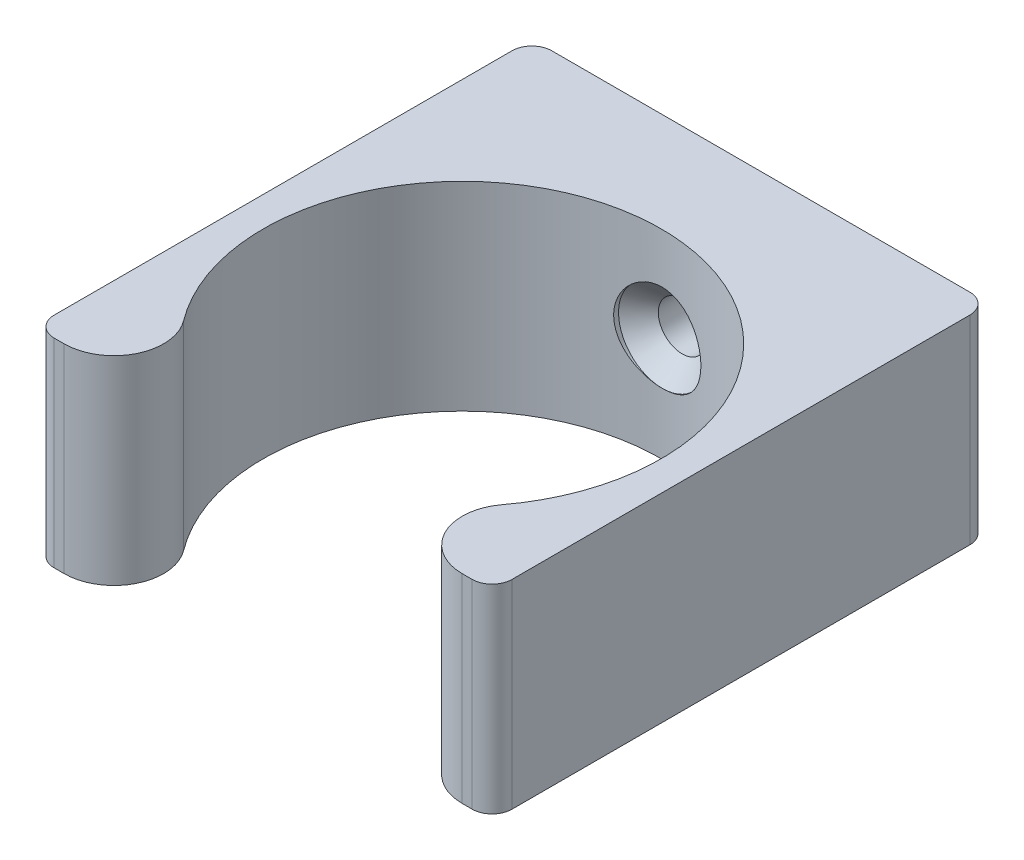
ISO-10303-21;
HEADER;
FILE_DESCRIPTION(('STEP AP214'),'2;1');
FILE_NAME('part.step','',(''),(''),'','','');
FILE_SCHEMA(('AUTOMOTIVE_DESIGN { 1 0 10303 214 1 1 1 1 }'));
ENDSEC;
DATA;
#1=APPLICATION_CONTEXT('core data for automotive mechanical design processes');
#2=APPLICATION_PROTOCOL_DEFINITION('international standard','automotive_design',2000,#1);
#3=PRODUCT_CONTEXT('',#1,'mechanical');
#4=PRODUCT('Part','Part','',(#3));
#5=PRODUCT_RELATED_PRODUCT_CATEGORY('part','',(#4));
#6=PRODUCT_DEFINITION_FORMATION('','',#4);
#7=PRODUCT_DEFINITION_CONTEXT('part definition',#1,'design');
#8=PRODUCT_DEFINITION('design','',#6,#7);
#9=PRODUCT_DEFINITION_SHAPE('','',#8);
#10=(LENGTH_UNIT() NAMED_UNIT(*) SI_UNIT(.MILLI.,.METRE.));
#11=(NAMED_UNIT(*) PLANE_ANGLE_UNIT() SI_UNIT($,.RADIAN.));
#12=(NAMED_UNIT(*) SI_UNIT($,.STERADIAN.) SOLID_ANGLE_UNIT());
#13=UNCERTAINTY_MEASURE_WITH_UNIT(LENGTH_MEASURE(1.E-05),#10,'distance_accuracy_value','');
#14=(GEOMETRIC_REPRESENTATION_CONTEXT(3) GLOBAL_UNCERTAINTY_ASSIGNED_CONTEXT((#13)) GLOBAL_UNIT_ASSIGNED_CONTEXT((#10,
#11,#12)) REPRESENTATION_CONTEXT('',''));
#15=CARTESIAN_POINT('',(0.,0.,0.));
#16=DIRECTION('',(0.,0.,1.));
#17=DIRECTION('',(1.,0.,0.));
#18=AXIS2_PLACEMENT_3D('',#15,#16,#17);
#19=CARTESIAN_POINT('',(10.,10.,9.99974885724246));
#20=DIRECTION('',(0.,-1.,0.));
#21=DIRECTION('',(0.,0.,-1.));
#22=AXIS2_PLACEMENT_3D('',#19,#20,#21);
#23=CYLINDRICAL_SURFACE('',#22,2.50025114275754);
#24=CARTESIAN_POINT('',(10.,0.,9.99974885724246));
#25=DIRECTION('',(0.,1.,0.));
#26=DIRECTION('',(0.,0.,-1.));
#27=AXIS2_PLACEMENT_3D('',#24,#25,#26);
#28=CIRCLE('',#27,2.50025114275754);
#29=CARTESIAN_POINT('',(7.97597757954962,0.,8.53189701922387));
#30=VERTEX_POINT('',#29);
#31=CARTESIAN_POINT('',(10.,0.,12.5));
#32=VERTEX_POINT('',#31);
#33=EDGE_CURVE('E163',#30,#32,#28,.T.);
#34=ORIENTED_EDGE('',*,*,#33,.T.);
#35=DIRECTION('',(0.,-1.,0.));
#36=VECTOR('',#35,1.);
#37=CARTESIAN_POINT('',(10.,10.,12.5));
#38=LINE('',#37,#36);
#39=CARTESIAN_POINT('',(10.,10.,12.5));
#40=VERTEX_POINT('',#39);
#41=EDGE_CURVE('E11',#40,#32,#38,.T.);
#42=ORIENTED_EDGE('',*,*,#41,.F.);
#43=CARTESIAN_POINT('',(10.,10.,9.99974885724246));
#44=DIRECTION('',(0.,1.,0.));
#45=DIRECTION('',(0.,0.,-1.));
#46=AXIS2_PLACEMENT_3D('',#43,#44,#45);
#47=CIRCLE('',#46,2.50025114275754);
#48=CARTESIAN_POINT('',(7.97597757954962,10.,8.53189701922387));
#49=VERTEX_POINT('',#48);
#50=EDGE_CURVE('E187',#49,#40,#47,.T.);
#51=ORIENTED_EDGE('',*,*,#50,.F.);
#52=DIRECTION('',(0.,-1.,0.));
#53=VECTOR('',#52,1.);
#54=CARTESIAN_POINT('',(7.97597757954962,10.,8.53189701922387));
#55=LINE('',#54,#53);
#56=EDGE_CURVE('E159',#49,#30,#55,.T.);
#57=ORIENTED_EDGE('',*,*,#56,.T.);
#58=EDGE_LOOP('',(#34,#42,#51,#57));
#59=FACE_BOUND('',#58,.T.);
#60=ADVANCED_FACE('F33',(#59),#23,.T.);
#61=CARTESIAN_POINT('',(10.,10.,12.5));
#62=DIRECTION('',(0.,0.,-1.));
#63=DIRECTION('',(-1.,0.,0.));
#64=AXIS2_PLACEMENT_3D('',#61,#62,#63);
#65=PLANE('',#64);
#66=DIRECTION('',(1.,0.,0.));
#67=VECTOR('',#66,1.);
#68=CARTESIAN_POINT('',(10.,0.,12.5));
#69=LINE('',#68,#67);
#70=CARTESIAN_POINT('',(10.5,0.,12.5));
#71=VERTEX_POINT('',#70);
#72=EDGE_CURVE('E166',#32,#71,#69,.T.);
#73=ORIENTED_EDGE('',*,*,#72,.T.);
#74=DIRECTION('',(0.,-1.,0.));
#75=VECTOR('',#74,1.);
#76=CARTESIAN_POINT('',(10.5,10.,12.5));
#77=LINE('',#76,#75);
#78=CARTESIAN_POINT('',(10.5,10.,12.5));
#79=VERTEX_POINT('',#78);
#80=EDGE_CURVE('E41',#79,#71,#77,.T.);
#81=ORIENTED_EDGE('',*,*,#80,.F.);
#82=DIRECTION('',(1.,0.,0.));
#83=VECTOR('',#82,1.);
#84=CARTESIAN_POINT('',(10.,10.,12.5));
#85=LINE('',#84,#83);
#86=EDGE_CURVE('E109',#40,#79,#85,.T.);
#87=ORIENTED_EDGE('',*,*,#86,.F.);
#88=ORIENTED_EDGE('',*,*,#41,.T.);
#89=EDGE_LOOP('',(#73,#81,#87,#88));
#90=FACE_BOUND('',#89,.T.);
#91=ADVANCED_FACE('F287',(#90),#65,.F.);
#92=CARTESIAN_POINT('',(10.5,10.,11.5));
#93=DIRECTION('',(0.,-1.,0.));
#94=DIRECTION('',(0.,0.,-1.));
#95=AXIS2_PLACEMENT_3D('',#92,#93,#94);
#96=CYLINDRICAL_SURFACE('',#95,0.999999999999999);
#97=CARTESIAN_POINT('',(10.5,0.,11.5));
#98=DIRECTION('',(0.,1.,0.));
#99=DIRECTION('',(0.,0.,-1.));
#100=AXIS2_PLACEMENT_3D('',#97,#98,#99);
#101=CIRCLE('',#100,0.999999999999999);
#102=CARTESIAN_POINT('',(11.5,0.,11.5));
#103=VERTEX_POINT('',#102);
#104=EDGE_CURVE('E169',#71,#103,#101,.T.);
#105=ORIENTED_EDGE('',*,*,#104,.T.);
#106=DIRECTION('',(0.,-1.,0.));
#107=VECTOR('',#106,1.);
#108=CARTESIAN_POINT('',(11.5,10.,11.5));
#109=LINE('',#108,#107);
#110=CARTESIAN_POINT('',(11.5,10.,11.5));
#111=VERTEX_POINT('',#110);
#112=EDGE_CURVE('E206',#111,#103,#109,.T.);
#113=ORIENTED_EDGE('',*,*,#112,.F.);
#114=CARTESIAN_POINT('',(10.5,10.,11.5));
#115=DIRECTION('',(0.,1.,0.));
#116=DIRECTION('',(0.,0.,-1.));
#117=AXIS2_PLACEMENT_3D('',#114,#115,#116);
#118=CIRCLE('',#117,0.999999999999999);
#119=EDGE_CURVE('E215',#79,#111,#118,.T.);
#120=ORIENTED_EDGE('',*,*,#119,.F.);
#121=ORIENTED_EDGE('',*,*,#80,.T.);
#122=EDGE_LOOP('',(#105,#113,#120,#121));
#123=FACE_BOUND('',#122,.T.);
#124=ADVANCED_FACE('F213',(#123),#96,.T.);
#125=CARTESIAN_POINT('',(11.5,10.,11.5));
#126=DIRECTION('',(-1.,0.,0.));
#127=DIRECTION('',(0.,0.,1.));
#128=AXIS2_PLACEMENT_3D('',#125,#126,#127);
#129=PLANE('',#128);
#130=DIRECTION('',(0.,0.,-1.));
#131=VECTOR('',#130,1.);
#132=CARTESIAN_POINT('',(11.5,0.,11.5));
#133=LINE('',#132,#131);
#134=CARTESIAN_POINT('',(11.5,0.,-11.5));
#135=VERTEX_POINT('',#134);
#136=EDGE_CURVE('E171',#103,#135,#133,.T.);
#137=ORIENTED_EDGE('',*,*,#136,.T.);
#138=DIRECTION('',(0.,-1.,0.));
#139=VECTOR('',#138,1.);
#140=CARTESIAN_POINT('',(11.5,10.,-11.5));
#141=LINE('',#140,#139);
#142=CARTESIAN_POINT('',(11.5,10.,-11.5));
#143=VERTEX_POINT('',#142);
#144=EDGE_CURVE('E203',#143,#135,#141,.T.);
#145=ORIENTED_EDGE('',*,*,#144,.F.);
#146=DIRECTION('',(0.,0.,-1.));
#147=VECTOR('',#146,1.);
#148=CARTESIAN_POINT('',(11.5,10.,11.5));
#149=LINE('',#148,#147);
#150=EDGE_CURVE('E233',#111,#143,#149,.T.);
#151=ORIENTED_EDGE('',*,*,#150,.F.);
#152=ORIENTED_EDGE('',*,*,#112,.T.);
#153=EDGE_LOOP('',(#137,#145,#151,#152));
#154=FACE_BOUND('',#153,.T.);
#155=ADVANCED_FACE('F224',(#154),#129,.F.);
#156=CARTESIAN_POINT('',(10.5,10.,-11.5));
#157=DIRECTION('',(0.,-1.,0.));
#158=DIRECTION('',(0.,0.,-1.));
#159=AXIS2_PLACEMENT_3D('',#156,#157,#158);
#160=CYLINDRICAL_SURFACE('',#159,0.999999999999999);
#161=CARTESIAN_POINT('',(10.5,0.,-11.5));
#162=DIRECTION('',(0.,1.,0.));
#163=DIRECTION('',(0.,0.,1.));
#164=AXIS2_PLACEMENT_3D('',#161,#162,#163);
#165=CIRCLE('',#164,0.999999999999999);
#166=CARTESIAN_POINT('',(10.5,0.,-12.5));
#167=VERTEX_POINT('',#166);
#168=EDGE_CURVE('E173',#135,#167,#165,.T.);
#169=ORIENTED_EDGE('',*,*,#168,.T.);
#170=DIRECTION('',(0.,-1.,0.));
#171=VECTOR('',#170,1.);
#172=CARTESIAN_POINT('',(10.5,10.,-12.5));
#173=LINE('',#172,#171);
#174=CARTESIAN_POINT('',(10.5,10.,-12.5));
#175=VERTEX_POINT('',#174);
#176=EDGE_CURVE('E200',#175,#167,#173,.T.);
#177=ORIENTED_EDGE('',*,*,#176,.F.);
#178=CARTESIAN_POINT('',(10.5,10.,-11.5));
#179=DIRECTION('',(0.,1.,0.));
#180=DIRECTION('',(0.,0.,1.));
#181=AXIS2_PLACEMENT_3D('',#178,#179,#180);
#182=CIRCLE('',#181,0.999999999999999);
#183=EDGE_CURVE('E230',#143,#175,#182,.T.);
#184=ORIENTED_EDGE('',*,*,#183,.F.);
#185=ORIENTED_EDGE('',*,*,#144,.T.);
#186=EDGE_LOOP('',(#169,#177,#184,#185));
#187=FACE_BOUND('',#186,.T.);
#188=ADVANCED_FACE('F228',(#187),#160,.T.);
#189=CARTESIAN_POINT('',(-10.5,10.,-12.5));
#190=DIRECTION('',(0.,0.,1.));
#191=DIRECTION('',(1.,0.,0.));
#192=AXIS2_PLACEMENT_3D('',#189,#190,#191);
#193=PLANE('',#192);
#194=CARTESIAN_POINT('',(0.0643291569938849,5.28572900904151,-12.5));
#195=DIRECTION('',(0.,0.,1.));
#196=DIRECTION('',(-1.,0.,0.));
#197=AXIS2_PLACEMENT_3D('',#194,#195,#196);
#198=ELLIPSE('',#197,1.2000110352571,1.2);
#199=CARTESIAN_POINT('',(-1.13568187826321,5.28572900904151,-12.5));
#200=VERTEX_POINT('',#199);
#201=EDGE_CURVE('E36',#200,#200,#198,.T.);
#202=ORIENTED_EDGE('',*,*,#201,.T.);
#203=EDGE_LOOP('',(#202));
#204=FACE_BOUND('',#203,.T.);
#205=DIRECTION('',(-1.,0.,0.));
#206=VECTOR('',#205,1.);
#207=CARTESIAN_POINT('',(-10.5,0.,-12.5));
#208=LINE('',#207,#206);
#209=CARTESIAN_POINT('',(-10.5,0.,-12.5));
#210=VERTEX_POINT('',#209);
#211=EDGE_CURVE('E175',#167,#210,#208,.T.);
#212=ORIENTED_EDGE('',*,*,#211,.T.);
#213=DIRECTION('',(0.,-1.,0.));
#214=VECTOR('',#213,1.);
#215=CARTESIAN_POINT('',(-10.5,10.,-12.5));
#216=LINE('',#215,#214);
#217=CARTESIAN_POINT('',(-10.5,10.,-12.5));
#218=VERTEX_POINT('',#217);
#219=EDGE_CURVE('E197',#218,#210,#216,.T.);
#220=ORIENTED_EDGE('',*,*,#219,.F.);
#221=DIRECTION('',(-1.,0.,0.));
#222=VECTOR('',#221,1.);
#223=CARTESIAN_POINT('',(-10.5,10.,-12.5));
#224=LINE('',#223,#222);
#225=EDGE_CURVE('E232',#175,#218,#224,.T.);
#226=ORIENTED_EDGE('',*,*,#225,.F.);
#227=ORIENTED_EDGE('',*,*,#176,.T.);
#228=EDGE_LOOP('',(#212,#220,#226,#227));
#229=FACE_BOUND('',#228,.T.);
#230=ADVANCED_FACE('F300',(#204,#229),#193,.F.);
#231=CARTESIAN_POINT('',(-10.5,10.,-11.5));
#232=DIRECTION('',(0.,-1.,0.));
#233=DIRECTION('',(0.,0.,-1.));
#234=AXIS2_PLACEMENT_3D('',#231,#232,#233);
#235=CYLINDRICAL_SURFACE('',#234,0.999999999999999);
#236=CARTESIAN_POINT('',(-10.5,0.,-11.5));
#237=DIRECTION('',(0.,1.,0.));
#238=DIRECTION('',(0.,0.,-1.));
#239=AXIS2_PLACEMENT_3D('',#236,#237,#238);
#240=CIRCLE('',#239,0.999999999999999);
#241=CARTESIAN_POINT('',(-11.5,0.,-11.5));
#242=VERTEX_POINT('',#241);
#243=EDGE_CURVE('E177',#210,#242,#240,.T.);
#244=ORIENTED_EDGE('',*,*,#243,.T.);
#245=DIRECTION('',(0.,-1.,0.));
#246=VECTOR('',#245,1.);
#247=CARTESIAN_POINT('',(-11.5,10.,-11.5));
#248=LINE('',#247,#246);
#249=CARTESIAN_POINT('',(-11.5,10.,-11.5));
#250=VERTEX_POINT('',#249);
#251=EDGE_CURVE('E194',#250,#242,#248,.T.);
#252=ORIENTED_EDGE('',*,*,#251,.F.);
#253=CARTESIAN_POINT('',(-10.5,10.,-11.5));
#254=DIRECTION('',(0.,1.,0.));
#255=DIRECTION('',(0.,0.,-1.));
#256=AXIS2_PLACEMENT_3D('',#253,#254,#255);
#257=CIRCLE('',#256,0.999999999999999);
#258=EDGE_CURVE('E235',#218,#250,#257,.T.);
#259=ORIENTED_EDGE('',*,*,#258,.F.);
#260=ORIENTED_EDGE('',*,*,#219,.T.);
#261=EDGE_LOOP('',(#244,#252,#259,#260));
#262=FACE_BOUND('',#261,.T.);
#263=ADVANCED_FACE('F303',(#262),#235,.T.);
#264=CARTESIAN_POINT('',(-11.5,10.,11.5));
#265=DIRECTION('',(1.,0.,0.));
#266=DIRECTION('',(0.,0.,-1.));
#267=AXIS2_PLACEMENT_3D('',#264,#265,#266);
#268=PLANE('',#267);
#269=DIRECTION('',(0.,0.,1.));
#270=VECTOR('',#269,1.);
#271=CARTESIAN_POINT('',(-11.5,0.,11.5));
#272=LINE('',#271,#270);
#273=CARTESIAN_POINT('',(-11.5,0.,11.5));
#274=VERTEX_POINT('',#273);
#275=EDGE_CURVE('E179',#242,#274,#272,.T.);
#276=ORIENTED_EDGE('',*,*,#275,.T.);
#277=DIRECTION('',(0.,-1.,0.));
#278=VECTOR('',#277,1.);
#279=CARTESIAN_POINT('',(-11.5,10.,11.5));
#280=LINE('',#279,#278);
#281=CARTESIAN_POINT('',(-11.5,10.,11.5));
#282=VERTEX_POINT('',#281);
#283=EDGE_CURVE('E191',#282,#274,#280,.T.);
#284=ORIENTED_EDGE('',*,*,#283,.F.);
#285=DIRECTION('',(0.,0.,1.));
#286=VECTOR('',#285,1.);
#287=CARTESIAN_POINT('',(-11.5,10.,11.5));
#288=LINE('',#287,#286);
#289=EDGE_CURVE('E241',#250,#282,#288,.T.);
#290=ORIENTED_EDGE('',*,*,#289,.F.);
#291=ORIENTED_EDGE('',*,*,#251,.T.);
#292=EDGE_LOOP('',(#276,#284,#290,#291));
#293=FACE_BOUND('',#292,.T.);
#294=ADVANCED_FACE('F247',(#293),#268,.F.);
#295=CARTESIAN_POINT('',(-10.5,10.,11.5));
#296=DIRECTION('',(0.,-1.,0.));
#297=DIRECTION('',(0.,0.,-1.));
#298=AXIS2_PLACEMENT_3D('',#295,#296,#297);
#299=CYLINDRICAL_SURFACE('',#298,0.999999999999999);
#300=CARTESIAN_POINT('',(-10.5,0.,11.5));
#301=DIRECTION('',(0.,1.,0.));
#302=DIRECTION('',(0.,0.,-1.));
#303=AXIS2_PLACEMENT_3D('',#300,#301,#302);
#304=CIRCLE('',#303,0.999999999999999);
#305=CARTESIAN_POINT('',(-10.5,0.,12.5));
#306=VERTEX_POINT('',#305);
#307=EDGE_CURVE('E181',#274,#306,#304,.T.);
#308=ORIENTED_EDGE('',*,*,#307,.T.);
#309=DIRECTION('',(0.,-1.,0.));
#310=VECTOR('',#309,1.);
#311=CARTESIAN_POINT('',(-10.5,10.,12.5));
#312=LINE('',#311,#310);
#313=CARTESIAN_POINT('',(-10.5,10.,12.5));
#314=VERTEX_POINT('',#313);
#315=EDGE_CURVE('E154',#314,#306,#312,.T.);
#316=ORIENTED_EDGE('',*,*,#315,.F.);
#317=CARTESIAN_POINT('',(-10.5,10.,11.5));
#318=DIRECTION('',(0.,1.,0.));
#319=DIRECTION('',(0.,0.,-1.));
#320=AXIS2_PLACEMENT_3D('',#317,#318,#319);
#321=CIRCLE('',#320,0.999999999999999);
#322=EDGE_CURVE('E142',#282,#314,#321,.T.);
#323=ORIENTED_EDGE('',*,*,#322,.F.);
#324=ORIENTED_EDGE('',*,*,#283,.T.);
#325=EDGE_LOOP('',(#308,#316,#323,#324));
#326=FACE_BOUND('',#325,.T.);
#327=ADVANCED_FACE('F251',(#326),#299,.T.);
#328=CARTESIAN_POINT('',(-10.5,10.,12.5));
#329=DIRECTION('',(0.,0.,-1.));
#330=DIRECTION('',(-1.,0.,0.));
#331=AXIS2_PLACEMENT_3D('',#328,#329,#330);
#332=PLANE('',#331);
#333=DIRECTION('',(1.,0.,0.));
#334=VECTOR('',#333,1.);
#335=CARTESIAN_POINT('',(-10.5,0.,12.5));
#336=LINE('',#335,#334);
#337=CARTESIAN_POINT('',(-10.,0.,12.5));
#338=VERTEX_POINT('',#337);
#339=EDGE_CURVE('E151',#306,#338,#336,.T.);
#340=ORIENTED_EDGE('',*,*,#339,.T.);
#341=DIRECTION('',(0.,-1.,0.));
#342=VECTOR('',#341,1.);
#343=CARTESIAN_POINT('',(-10.,10.,12.5));
#344=LINE('',#343,#342);
#345=CARTESIAN_POINT('',(-10.,10.,12.5));
#346=VERTEX_POINT('',#345);
#347=EDGE_CURVE('E148',#346,#338,#344,.T.);
#348=ORIENTED_EDGE('',*,*,#347,.F.);
#349=DIRECTION('',(1.,0.,0.));
#350=VECTOR('',#349,1.);
#351=CARTESIAN_POINT('',(-10.5,10.,12.5));
#352=LINE('',#351,#350);
#353=EDGE_CURVE('E135',#314,#346,#352,.T.);
#354=ORIENTED_EDGE('',*,*,#353,.F.);
#355=ORIENTED_EDGE('',*,*,#315,.T.);
#356=EDGE_LOOP('',(#340,#348,#354,#355));
#357=FACE_BOUND('',#356,.T.);
#358=ADVANCED_FACE('F149',(#357),#332,.F.);
#359=CARTESIAN_POINT('',(-10.,10.,10.));
#360=DIRECTION('',(0.,-1.,0.));
#361=DIRECTION('',(0.,0.,-1.));
#362=AXIS2_PLACEMENT_3D('',#359,#360,#361);
#363=CYLINDRICAL_SURFACE('',#362,2.5);
#364=CARTESIAN_POINT('',(-10.,0.,10.));
#365=DIRECTION('',(0.,1.,0.));
#366=DIRECTION('',(0.,0.,1.));
#367=AXIS2_PLACEMENT_3D('',#364,#365,#366);
#368=CIRCLE('',#367,2.5);
#369=CARTESIAN_POINT('',(-8.,0.,8.5));
#370=VERTEX_POINT('',#369);
#371=EDGE_CURVE('E184',#338,#370,#368,.T.);
#372=ORIENTED_EDGE('',*,*,#371,.T.);
#373=DIRECTION('',(0.,-1.,0.));
#374=VECTOR('',#373,1.);
#375=CARTESIAN_POINT('',(-8.,10.,8.5));
#376=LINE('',#375,#374);
#377=CARTESIAN_POINT('',(-8.,10.,8.5));
#378=VERTEX_POINT('',#377);
#379=EDGE_CURVE('E155',#378,#370,#376,.T.);
#380=ORIENTED_EDGE('',*,*,#379,.F.);
#381=CARTESIAN_POINT('',(-10.,10.,10.));
#382=DIRECTION('',(0.,1.,0.));
#383=DIRECTION('',(0.,0.,1.));
#384=AXIS2_PLACEMENT_3D('',#381,#382,#383);
#385=CIRCLE('',#384,2.5);
#386=EDGE_CURVE('E139',#346,#378,#385,.T.);
#387=ORIENTED_EDGE('',*,*,#386,.F.);
#388=ORIENTED_EDGE('',*,*,#347,.T.);
#389=EDGE_LOOP('',(#372,#380,#387,#388));
#390=FACE_BOUND('',#389,.T.);
#391=ADVANCED_FACE('F157',(#390),#363,.T.);
#392=CARTESIAN_POINT('',(0.,10.,2.5));
#393=DIRECTION('',(0.,-1.,0.));
#394=DIRECTION('',(0.,0.,-1.));
#395=AXIS2_PLACEMENT_3D('',#392,#393,#394);
#396=CYLINDRICAL_SURFACE('',#395,10.);
#397=CARTESIAN_POINT('',(0.0428857102835571,3.08572900904151,-7.49990804036984));
#398=CARTESIAN_POINT('',(-0.0791130965700967,3.08573315053045,-7.50042899803053));
#399=CARTESIAN_POINT('',(-0.201171446458629,3.09591143428329,-7.49869941852658));
#400=CARTESIAN_POINT('',(-0.441838480097566,3.13631266316326,-7.49096136599408));
#401=CARTESIAN_POINT('',(-0.56044465609506,3.16654981806342,-7.484949859411));
#402=CARTESIAN_POINT('',(-0.790691958664705,3.24607493708256,-7.46935869412483));
#403=CARTESIAN_POINT('',(-0.902340260438795,3.29534288539577,-7.45978278469753));
#404=CARTESIAN_POINT('',(-1.11579346293517,3.41146726381993,-7.43813510322189));
#405=CARTESIAN_POINT('',(-1.21759859524846,3.47832327997939,-7.42606338991605));
#406=CARTESIAN_POINT('',(-1.41012665120082,3.62887369012264,-7.40056169785456));
#407=CARTESIAN_POINT('',(-1.50066691306449,3.71279878388086,-7.38711452175588));
#408=CARTESIAN_POINT('',(-1.66650502788391,3.89460980665811,-7.3605188024117));
#409=CARTESIAN_POINT('',(-1.74180150909771,3.99249699073385,-7.34737028613614));
#410=CARTESIAN_POINT('',(-1.87581872072739,4.20080721846843,-7.32272948011885));
#411=CARTESIAN_POINT('',(-1.93434445117437,4.31135833175337,-7.31125737946287));
#412=CARTESIAN_POINT('',(-2.03190318365233,4.5410186812747,-7.29151996762257));
#413=CARTESIAN_POINT('',(-2.07093854566152,4.66012687938343,-7.28325426822036));
#414=CARTESIAN_POINT('',(-2.12780002628469,4.90153706317932,-7.27104434741743));
#415=CARTESIAN_POINT('',(-2.14595016138824,5.02375932063785,-7.26703418345366));
#416=CARTESIAN_POINT('',(-2.16153201164984,5.26957425683928,-7.2635980999492));
#417=CARTESIAN_POINT('',(-2.15896630424167,5.39316676318714,-7.26417161011462));
#418=CARTESIAN_POINT('',(-2.1334502058466,5.63580436681408,-7.26977732224502));
#419=CARTESIAN_POINT('',(-2.11087660864734,5.75489129269679,-7.27472710484019));
#420=CARTESIAN_POINT('',(-2.04658444843127,5.98754889393812,-7.28838914962984));
#421=CARTESIAN_POINT('',(-2.00486480006208,6.10111925616981,-7.29710162512241));
#422=CARTESIAN_POINT('',(-1.90312298032669,6.32057625591172,-7.31737342406124));
#423=CARTESIAN_POINT('',(-1.84295628006844,6.42639373529612,-7.32895508424967));
#424=CARTESIAN_POINT('',(-1.70613414163645,6.62657810000956,-7.3536249595698));
#425=CARTESIAN_POINT('',(-1.62947643100565,6.72094340442582,-7.36671338221731));
#426=CARTESIAN_POINT('',(-1.45986060121882,6.8977116262327,-7.39324611735096));
#427=CARTESIAN_POINT('',(-1.36658246606567,6.97980755392809,-7.40669194979403));
#428=CARTESIAN_POINT('',(-1.16743063927367,7.12725117425758,-7.43212801473775));
#429=CARTESIAN_POINT('',(-1.06155671433169,7.19259855659918,-7.44411822026852));
#430=CARTESIAN_POINT('',(-0.839845878799673,7.30476736166064,-7.46529332726084));
#431=CARTESIAN_POINT('',(-0.723987804019572,7.35154819010083,-7.47447207180418));
#432=CARTESIAN_POINT('',(-0.485811197444588,7.42489889540393,-7.48890405508978));
#433=CARTESIAN_POINT('',(-0.363493619159884,7.45147174636906,-7.49415787147999));
#434=CARTESIAN_POINT('',(-0.118505503998733,7.48320482537926,-7.50003336020426));
#435=CARTESIAN_POINT('',(0.00410861356346906,7.488784353525,-7.50074593826126));
#436=CARTESIAN_POINT('',(0.248497666219659,7.47950941566989,-7.49765874980621));
#437=CARTESIAN_POINT('',(0.370272658354746,7.46465635266206,-7.49385929311307));
#438=CARTESIAN_POINT('',(0.608136285368692,7.4152854739453,-7.48219430705659));
#439=CARTESIAN_POINT('',(0.724273057918867,7.38098792127097,-7.47437441124654));
#440=CARTESIAN_POINT('',(0.949130573141943,7.29394639895699,-7.4554956408139));
#441=CARTESIAN_POINT('',(1.05785067799643,7.24120084521045,-7.44443648805361));
#442=CARTESIAN_POINT('',(1.26652277745731,7.11788929808349,-7.42003658968601));
#443=CARTESIAN_POINT('',(1.36632581496518,7.04707741934031,-7.40666525727786));
#444=CARTESIAN_POINT('',(1.55277870243181,6.88996672879282,-7.37915867866659));
#445=CARTESIAN_POINT('',(1.63942682000296,6.80366588048695,-7.36502333218131));
#446=CARTESIAN_POINT('',(1.79877433305256,6.61610197090848,-7.33722972748727));
#447=CARTESIAN_POINT('',(1.87118327926867,6.51458976731418,-7.32358529335482));
#448=CARTESIAN_POINT('',(1.99793586940257,6.30058977541727,-7.29859391854289));
#449=CARTESIAN_POINT('',(2.05228029790048,6.1881024640613,-7.28724687809112));
#450=CARTESIAN_POINT('',(2.14099633988792,5.95595011663765,-7.26822373617696));
#451=CARTESIAN_POINT('',(2.1754807164375,5.83632994734037,-7.26052695392117));
#452=CARTESIAN_POINT('',(2.22382995427376,5.59279970143228,-7.24962593306802));
#453=CARTESIAN_POINT('',(2.23769815718337,5.46889032338084,-7.24642096640857));
#454=CARTESIAN_POINT('',(2.24427908417857,5.22322904999458,-7.2449073656441));
#455=CARTESIAN_POINT('',(2.23745209348674,5.10148991578506,-7.24649219844513));
#456=CARTESIAN_POINT('',(2.20386579282304,4.86094352403499,-7.25414100857965));
#457=CARTESIAN_POINT('',(2.17710672343396,4.74213623112461,-7.26020493184993));
#458=CARTESIAN_POINT('',(2.10463725150845,4.51119717751545,-7.27608613486889));
#459=CARTESIAN_POINT('',(2.05899459000768,4.39904317738771,-7.28588998867772));
#460=CARTESIAN_POINT('',(1.95010807551806,4.18392345936042,-7.30816767762686));
#461=CARTESIAN_POINT('',(1.88686236416767,4.08095871309086,-7.32064179463589));
#462=CARTESIAN_POINT('',(1.74303704658451,3.88487073056226,-7.34719570348709));
#463=CARTESIAN_POINT('',(1.66212952764371,3.79199170283814,-7.36130310606057));
#464=CARTESIAN_POINT('',(1.48593533150631,3.62098776298444,-7.38938517651152));
#465=CARTESIAN_POINT('',(1.39064533250068,3.5428662686966,-7.4033598129304));
#466=CARTESIAN_POINT('',(1.18687509230693,3.4026101401581,-7.42985449945564));
#467=CARTESIAN_POINT('',(1.0782377930536,3.34069938421952,-7.44235299086709));
#468=CARTESIAN_POINT('',(0.851844155779788,3.23612381127972,-7.46429875565806));
#469=CARTESIAN_POINT('',(0.734095520148958,3.1934429418772,-7.4737485720809));
#470=CARTESIAN_POINT('',(0.520685463574309,3.13609731716026,-7.48686966248674));
#471=CARTESIAN_POINT('',(0.426177699583284,3.11724541730707,-7.49137032044164));
#472=CARTESIAN_POINT('',(0.235420837493441,3.09205991245887,-7.49768386868882));
#473=CARTESIAN_POINT('',(0.139171818471444,3.08572574042059,-7.49949688072843));
#474=CARTESIAN_POINT('',(0.0428857102835571,3.08572900904151,-7.49990804036984));
#475=B_SPLINE_CURVE_WITH_KNOTS('',3,(#397,#398,#399,#400,#401,#402,#403,#404,#405,#406,#407,
#408,#409,#410,#411,#412,#413,#414,#415,#416,#417,#418,#419,#420,#421,#422,#423,#424,#425,#426,
#427,#428,#429,#430,#431,#432,#433,#434,#435,#436,#437,#438,#439,#440,#441,#442,#443,#444,#445,
#446,#447,#448,#449,#450,#451,#452,#453,#454,#455,#456,#457,#458,#459,#460,#461,#462,#463,#464,
#465,#466,#467,#468,#469,#470,#471,#472,#473,#474),.UNSPECIFIED.,.T.,.F.,(4,2,2,2,2,2,2,2,2,2,2,
2,2,2,2,2,2,2,2,2,2,2,2,2,2,2,2,2,2,2,2,2,2,2,2,2,2,2,4),(0.,0.365647292998013,
0.731553888790033,1.09707668237147,1.46259087380451,1.83341973724597,2.20428195564312,
2.57929592944874,2.95426448392021,3.32333377483996,3.69235714742461,4.05457522815845,
4.41681384486698,4.78196636871187,5.14716924275049,5.52036449745559,5.89356666567603,
6.26758037368995,6.64153902570484,7.00798768778329,7.37441118911516,7.73676456307711,
8.09914905951485,8.46675652458007,8.83441235841127,9.20892855627081,9.58342848597577,
9.955780535364,10.3280722245764,10.692144920878,11.0562132228459,11.4189866749658,
11.7817984397711,12.1520268531898,12.5223409065909,12.8975275071911,13.27240033291,
13.5609961861605,13.8495789659449),.UNSPECIFIED.);
#476=CARTESIAN_POINT('',(0.0428857102835571,3.08572900904151,-7.49990804036984));
#477=VERTEX_POINT('',#476);
#478=CARTESIAN_POINT('',(0.0428857102835571,7.48572900904151,-7.49990804036984));
#479=VERTEX_POINT('',#478);
#480=EDGE_CURVE('E167',#477,#479,#475,.T.);
#481=ORIENTED_EDGE('',*,*,#480,.T.);
#482=EDGE_CURVE('E266',#479,#477,#475,.T.);
#483=ORIENTED_EDGE('',*,*,#482,.T.);
#484=EDGE_LOOP('',(#481,#483));
#485=FACE_BOUND('',#484,.T.);
#486=CARTESIAN_POINT('',(0.,0.,2.5));
#487=DIRECTION('',(0.,-1.,0.));
#488=DIRECTION('',(0.,0.,1.));
#489=AXIS2_PLACEMENT_3D('',#486,#487,#488);
#490=CIRCLE('',#489,10.);
#491=EDGE_CURVE('E101',#370,#30,#490,.T.);
#492=ORIENTED_EDGE('',*,*,#491,.T.);
#493=ORIENTED_EDGE('',*,*,#56,.F.);
#494=CARTESIAN_POINT('',(0.,10.,2.5));
#495=DIRECTION('',(0.,-1.,0.));
#496=DIRECTION('',(0.,0.,1.));
#497=AXIS2_PLACEMENT_3D('',#494,#495,#496);
#498=CIRCLE('',#497,10.);
#499=EDGE_CURVE('E56',#378,#49,#498,.T.);
#500=ORIENTED_EDGE('',*,*,#499,.F.);
#501=ORIENTED_EDGE('',*,*,#379,.T.);
#502=EDGE_LOOP('',(#492,#493,#500,#501));
#503=FACE_BOUND('',#502,.T.);
#504=ADVANCED_FACE('F252',(#485,#503),#396,.F.);
#505=CARTESIAN_POINT('',(10.,10.,9.99974885724246));
#506=DIRECTION('',(0.,-1.,0.));
#507=DIRECTION('',(0.,0.,-1.));
#508=AXIS2_PLACEMENT_3D('',#505,#506,#507);
#509=PLANE('',#508);
#510=ORIENTED_EDGE('',*,*,#50,.T.);
#511=ORIENTED_EDGE('',*,*,#86,.T.);
#512=ORIENTED_EDGE('',*,*,#119,.T.);
#513=ORIENTED_EDGE('',*,*,#150,.T.);
#514=ORIENTED_EDGE('',*,*,#183,.T.);
#515=ORIENTED_EDGE('',*,*,#225,.T.);
#516=ORIENTED_EDGE('',*,*,#258,.T.);
#517=ORIENTED_EDGE('',*,*,#289,.T.);
#518=ORIENTED_EDGE('',*,*,#322,.T.);
#519=ORIENTED_EDGE('',*,*,#353,.T.);
#520=ORIENTED_EDGE('',*,*,#386,.T.);
#521=ORIENTED_EDGE('',*,*,#499,.T.);
#522=EDGE_LOOP('',(#510,#511,#512,#513,#514,#515,#516,#517,#518,#519,#520,#521));
#523=FACE_BOUND('',#522,.T.);
#524=ADVANCED_FACE('F137',(#523),#509,.F.);
#525=CARTESIAN_POINT('',(10.,0.,9.99974885724246));
#526=DIRECTION('',(0.,-1.,0.));
#527=DIRECTION('',(0.,0.,-1.));
#528=AXIS2_PLACEMENT_3D('',#525,#526,#527);
#529=PLANE('',#528);
#530=ORIENTED_EDGE('',*,*,#33,.F.);
#531=ORIENTED_EDGE('',*,*,#491,.F.);
#532=ORIENTED_EDGE('',*,*,#371,.F.);
#533=ORIENTED_EDGE('',*,*,#339,.F.);
#534=ORIENTED_EDGE('',*,*,#307,.F.);
#535=ORIENTED_EDGE('',*,*,#275,.F.);
#536=ORIENTED_EDGE('',*,*,#243,.F.);
#537=ORIENTED_EDGE('',*,*,#211,.F.);
#538=ORIENTED_EDGE('',*,*,#168,.F.);
#539=ORIENTED_EDGE('',*,*,#136,.F.);
#540=ORIENTED_EDGE('',*,*,#104,.F.);
#541=ORIENTED_EDGE('',*,*,#72,.F.);
#542=EDGE_LOOP('',(#530,#531,#532,#533,#534,#535,#536,#537,#538,#539,#540,#541));
#543=FACE_BOUND('',#542,.T.);
#544=ADVANCED_FACE('F219',(#543),#529,.T.);
#545=CARTESIAN_POINT('',(0.0428857102835571,5.28572900904151,-7.49990804036984));
#546=DIRECTION('',(-0.00428857102835584,0.,0.999990804036985));
#547=DIRECTION('',(0.999990804036985,0.,0.00428857102835584));
#548=AXIS2_PLACEMENT_3D('',#545,#546,#547);
#549=CYLINDRICAL_SURFACE('',#548,2.2);
#550=CARTESIAN_POINT('',(0.0428857102835571,5.28572900904151,-7.49990804036984));
#551=DIRECTION('',(-0.00428857102835584,0.,0.999990804036985));
#552=DIRECTION('',(0.999990804036985,0.,0.00428857102835584));
#553=AXIS2_PLACEMENT_3D('',#550,#551,#552);
#554=CIRCLE('',#553,2.2);
#555=EDGE_CURVE('E432',#479,#477,#554,.T.);
#556=ORIENTED_EDGE('',*,*,#555,.F.);
#557=ORIENTED_EDGE('',*,*,#480,.F.);
#558=EDGE_LOOP('',(#556,#557));
#559=FACE_BOUND('',#558,.T.);
#560=ADVANCED_FACE('F275',(#559),#549,.F.);
#561=CARTESIAN_POINT('',(0.0428857102835571,5.28572900904151,-7.49990804036984));
#562=DIRECTION('',(-0.00428857102835584,0.,0.999990804036985));
#563=DIRECTION('',(0.999990804036985,0.,0.00428857102835584));
#564=AXIS2_PLACEMENT_3D('',#561,#562,#563);
#565=CIRCLE('',#564,2.2);
#566=EDGE_CURVE('E47',#477,#479,#565,.T.);
#567=ORIENTED_EDGE('',*,*,#566,.F.);
#568=ORIENTED_EDGE('',*,*,#482,.F.);
#569=EDGE_LOOP('',(#567,#568));
#570=FACE_BOUND('',#569,.T.);
#571=ADVANCED_FACE('F270',(#570),#549,.F.);
#572=CARTESIAN_POINT('',(0.0428857102835571,5.28572900904151,-7.49990804036984));
#573=DIRECTION('',(-0.00428857102835584,0.,0.999990804036985));
#574=DIRECTION('',(0.999990804036985,0.,0.00428857102835584));
#575=AXIS2_PLACEMENT_3D('',#572,#573,#574);
#576=CYLINDRICAL_SURFACE('',#575,1.2);
#577=CARTESIAN_POINT('',(0.047174281311913,5.28572900904151,-8.49989884440683));
#578=DIRECTION('',(-0.00428857102835584,0.,0.999990804036985));
#579=DIRECTION('',(0.999990804036985,0.,0.00428857102835584));
#580=AXIS2_PLACEMENT_3D('',#577,#578,#579);
#581=CIRCLE('',#580,1.2);
#582=CARTESIAN_POINT('',(1.24716324615629,5.28572900904151,-8.4947525591728));
#583=VERTEX_POINT('',#582);
#584=EDGE_CURVE('E434',#583,#583,#581,.T.);
#585=ORIENTED_EDGE('',*,*,#584,.T.);
#586=EDGE_LOOP('',(#585));
#587=FACE_BOUND('',#586,.T.);
#588=ORIENTED_EDGE('',*,*,#201,.F.);
#589=EDGE_LOOP('',(#588));
#590=FACE_BOUND('',#589,.T.);
#591=ADVANCED_FACE('F274',(#587,#590),#576,.F.);
#592=CARTESIAN_POINT('',(0.0428857102835571,5.28572900904151,-7.49990804036984));
#593=DIRECTION('',(-0.00428857102835584,0.,0.999990804036985));
#594=DIRECTION('',(0.999990804036985,0.,0.00428857102835584));
#595=AXIS2_PLACEMENT_3D('',#592,#593,#594);
#596=CONICAL_SURFACE('',#595,2.2,0.785398163397447);
#597=ORIENTED_EDGE('',*,*,#584,.F.);
#598=EDGE_LOOP('',(#597));
#599=FACE_BOUND('',#598,.T.);
#600=ORIENTED_EDGE('',*,*,#555,.T.);
#601=ORIENTED_EDGE('',*,*,#566,.T.);
#602=EDGE_LOOP('',(#600,#601));
#603=FACE_BOUND('',#602,.T.);
#604=ADVANCED_FACE('F279',(#599,#603),#596,.F.);
#605=CLOSED_SHELL('',(#60,#91,#124,#155,#188,#230,#263,#294,#327,#358,#391,#504,#524,#544,#560,
#571,#591,#604));
#606=MANIFOLD_SOLID_BREP('B2',#605);
#607=ADVANCED_BREP_SHAPE_REPRESENTATION('',(#18,#606),#14);
#608=SHAPE_DEFINITION_REPRESENTATION(#9,#607);
ENDSEC;
END-ISO-10303-21;
